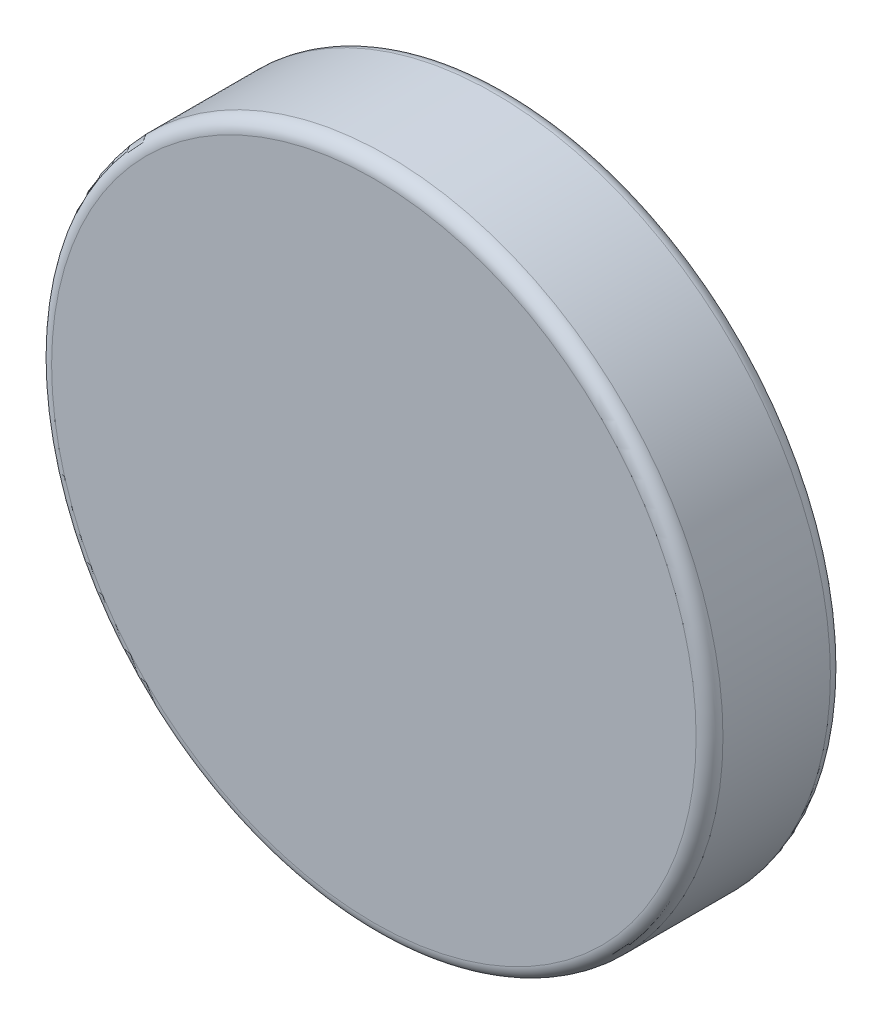
ISO-10303-21;
HEADER;
FILE_DESCRIPTION(('STEP AP214'),'2;1');
FILE_NAME('part.step','',(''),(''),'','','');
FILE_SCHEMA(('AUTOMOTIVE_DESIGN { 1 0 10303 214 1 1 1 1 }'));
ENDSEC;
DATA;
#1=APPLICATION_CONTEXT('core data for automotive mechanical design processes');
#2=APPLICATION_PROTOCOL_DEFINITION('international standard','automotive_design',2000,#1);
#3=PRODUCT_CONTEXT('',#1,'mechanical');
#4=PRODUCT('Part','Part','',(#3));
#5=PRODUCT_RELATED_PRODUCT_CATEGORY('part','',(#4));
#6=PRODUCT_DEFINITION_FORMATION('','',#4);
#7=PRODUCT_DEFINITION_CONTEXT('part definition',#1,'design');
#8=PRODUCT_DEFINITION('design','',#6,#7);
#9=PRODUCT_DEFINITION_SHAPE('','',#8);
#10=(LENGTH_UNIT() NAMED_UNIT(*) SI_UNIT(.MILLI.,.METRE.));
#11=(NAMED_UNIT(*) PLANE_ANGLE_UNIT() SI_UNIT($,.RADIAN.));
#12=(NAMED_UNIT(*) SI_UNIT($,.STERADIAN.) SOLID_ANGLE_UNIT());
#13=UNCERTAINTY_MEASURE_WITH_UNIT(LENGTH_MEASURE(1.E-05),#10,'distance_accuracy_value','');
#14=(GEOMETRIC_REPRESENTATION_CONTEXT(3) GLOBAL_UNCERTAINTY_ASSIGNED_CONTEXT((#13)) GLOBAL_UNIT_ASSIGNED_CONTEXT((#10,
#11,#12)) REPRESENTATION_CONTEXT('',''));
#15=CARTESIAN_POINT('',(0.,0.,0.));
#16=DIRECTION('',(0.,0.,1.));
#17=DIRECTION('',(1.,0.,0.));
#18=AXIS2_PLACEMENT_3D('',#15,#16,#17);
#19=CARTESIAN_POINT('',(0.,0.,2.));
#20=DIRECTION('',(0.,0.,-1.));
#21=DIRECTION('',(-1.,0.,0.));
#22=AXIS2_PLACEMENT_3D('',#19,#20,#21);
#23=CYLINDRICAL_SURFACE('',#22,5.);
#24=CARTESIAN_POINT('',(0.,0.,0.2));
#25=DIRECTION('',(0.,0.,1.));
#26=DIRECTION('',(1.,0.,0.));
#27=AXIS2_PLACEMENT_3D('',#24,#25,#26);
#28=CIRCLE('',#27,5.);
#29=CARTESIAN_POINT('',(5.,0.,0.2));
#30=VERTEX_POINT('',#29);
#31=EDGE_CURVE('E46',#30,#30,#28,.T.);
#32=ORIENTED_EDGE('',*,*,#31,.T.);
#33=EDGE_LOOP('',(#32));
#34=FACE_BOUND('',#33,.T.);
#35=CARTESIAN_POINT('',(0.,0.,1.8));
#36=DIRECTION('',(0.,0.,1.));
#37=DIRECTION('',(1.,0.,0.));
#38=AXIS2_PLACEMENT_3D('',#35,#36,#37);
#39=CIRCLE('',#38,5.);
#40=CARTESIAN_POINT('',(5.,0.,1.8));
#41=VERTEX_POINT('',#40);
#42=EDGE_CURVE('E50',#41,#41,#39,.F.);
#43=ORIENTED_EDGE('',*,*,#42,.T.);
#44=EDGE_LOOP('',(#43));
#45=FACE_BOUND('',#44,.T.);
#46=ADVANCED_FACE('F35',(#34,#45),#23,.T.);
#47=CARTESIAN_POINT('',(0.,0.,2.));
#48=DIRECTION('',(0.,0.,1.));
#49=DIRECTION('',(1.,0.,0.));
#50=AXIS2_PLACEMENT_3D('',#47,#48,#49);
#51=PLANE('',#50);
#52=CARTESIAN_POINT('',(0.,0.,2.));
#53=DIRECTION('',(0.,0.,1.));
#54=DIRECTION('',(1.,0.,0.));
#55=AXIS2_PLACEMENT_3D('',#52,#53,#54);
#56=CIRCLE('',#55,4.8);
#57=CARTESIAN_POINT('',(4.8,0.,2.));
#58=VERTEX_POINT('',#57);
#59=EDGE_CURVE('E10',#58,#58,#56,.T.);
#60=ORIENTED_EDGE('',*,*,#59,.T.);
#61=EDGE_LOOP('',(#60));
#62=FACE_BOUND('',#61,.T.);
#63=ADVANCED_FACE('F66',(#62),#51,.T.);
#64=CARTESIAN_POINT('',(0.,0.,0.));
#65=DIRECTION('',(0.,0.,1.));
#66=DIRECTION('',(1.,0.,0.));
#67=AXIS2_PLACEMENT_3D('',#64,#65,#66);
#68=PLANE('',#67);
#69=CARTESIAN_POINT('',(0.,0.,0.));
#70=DIRECTION('',(0.,0.,1.));
#71=DIRECTION('',(1.,0.,0.));
#72=AXIS2_PLACEMENT_3D('',#69,#70,#71);
#73=CIRCLE('',#72,4.8);
#74=CARTESIAN_POINT('',(4.8,0.,0.));
#75=VERTEX_POINT('',#74);
#76=EDGE_CURVE('E42',#75,#75,#73,.F.);
#77=ORIENTED_EDGE('',*,*,#76,.T.);
#78=EDGE_LOOP('',(#77));
#79=FACE_BOUND('',#78,.T.);
#80=ADVANCED_FACE('F63',(#79),#68,.F.);
#81=CARTESIAN_POINT('',(0.,0.,0.2));
#82=DIRECTION('',(0.,0.,1.));
#83=DIRECTION('',(1.,0.,0.));
#84=AXIS2_PLACEMENT_3D('',#81,#82,#83);
#85=TOROIDAL_SURFACE('',#84,4.8,0.2);
#86=ORIENTED_EDGE('',*,*,#76,.F.);
#87=EDGE_LOOP('',(#86));
#88=FACE_BOUND('',#87,.T.);
#89=ORIENTED_EDGE('',*,*,#31,.F.);
#90=EDGE_LOOP('',(#89));
#91=FACE_BOUND('',#90,.T.);
#92=ADVANCED_FACE('F59',(#88,#91),#85,.T.);
#93=CARTESIAN_POINT('',(0.,0.,1.8));
#94=DIRECTION('',(0.,0.,1.));
#95=DIRECTION('',(1.,0.,0.));
#96=AXIS2_PLACEMENT_3D('',#93,#94,#95);
#97=TOROIDAL_SURFACE('',#96,4.8,0.2);
#98=ORIENTED_EDGE('',*,*,#42,.F.);
#99=EDGE_LOOP('',(#98));
#100=FACE_BOUND('',#99,.T.);
#101=ORIENTED_EDGE('',*,*,#59,.F.);
#102=EDGE_LOOP('',(#101));
#103=FACE_BOUND('',#102,.T.);
#104=ADVANCED_FACE('F37',(#100,#103),#97,.T.);
#105=CLOSED_SHELL('',(#46,#63,#80,#92,#104));
#106=MANIFOLD_SOLID_BREP('B2',#105);
#107=ADVANCED_BREP_SHAPE_REPRESENTATION('',(#18,#106),#14);
#108=SHAPE_DEFINITION_REPRESENTATION(#9,#107);
ENDSEC;
END-ISO-10303-21;
